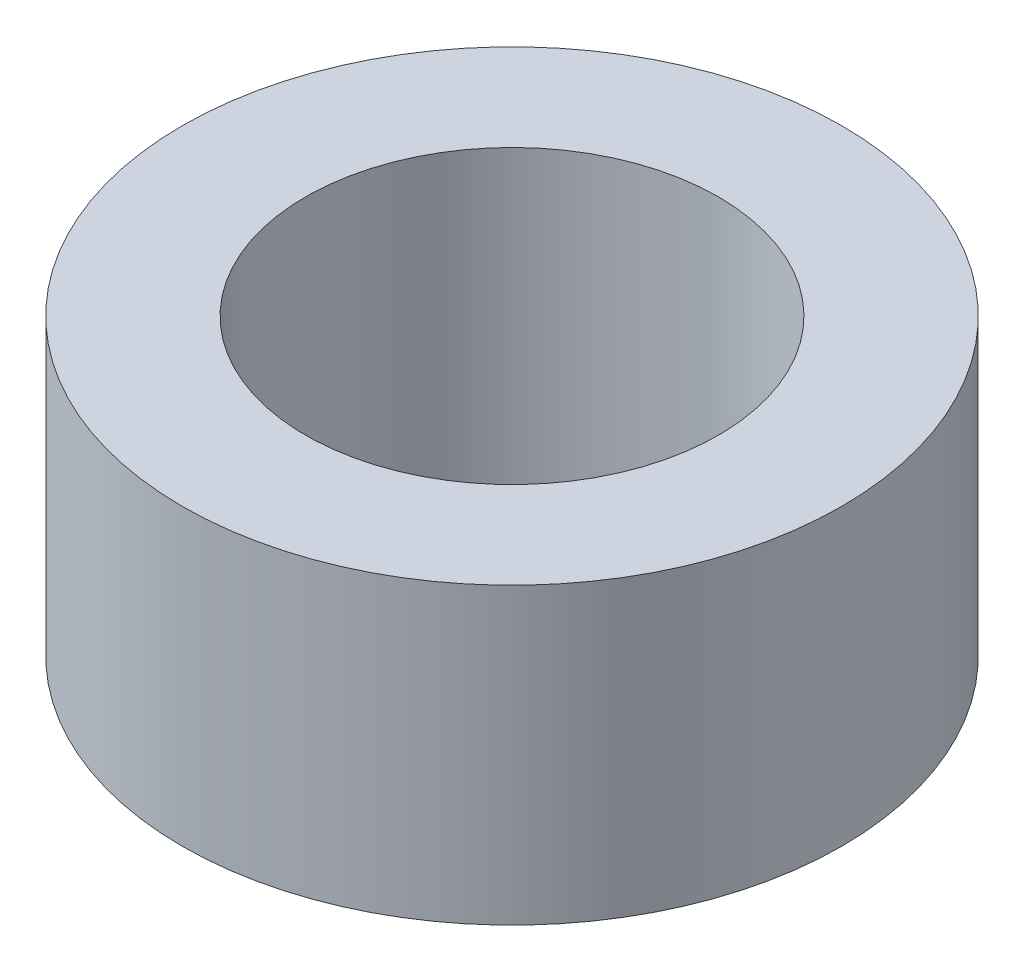
ISO-10303-21;
HEADER;
FILE_DESCRIPTION(('STEP AP214'),'2;1');
FILE_NAME('part.step','',(''),(''),'','','');
FILE_SCHEMA(('AUTOMOTIVE_DESIGN { 1 0 10303 214 1 1 1 1 }'));
ENDSEC;
DATA;
#1=APPLICATION_CONTEXT('core data for automotive mechanical design processes');
#2=APPLICATION_PROTOCOL_DEFINITION('international standard','automotive_design',2000,#1);
#3=PRODUCT_CONTEXT('',#1,'mechanical');
#4=PRODUCT('Part','Part','',(#3));
#5=PRODUCT_RELATED_PRODUCT_CATEGORY('part','',(#4));
#6=PRODUCT_DEFINITION_FORMATION('','',#4);
#7=PRODUCT_DEFINITION_CONTEXT('part definition',#1,'design');
#8=PRODUCT_DEFINITION('design','',#6,#7);
#9=PRODUCT_DEFINITION_SHAPE('','',#8);
#10=(LENGTH_UNIT() NAMED_UNIT(*) SI_UNIT(.MILLI.,.METRE.));
#11=(NAMED_UNIT(*) PLANE_ANGLE_UNIT() SI_UNIT($,.RADIAN.));
#12=(NAMED_UNIT(*) SI_UNIT($,.STERADIAN.) SOLID_ANGLE_UNIT());
#13=UNCERTAINTY_MEASURE_WITH_UNIT(LENGTH_MEASURE(1.E-05),#10,'distance_accuracy_value','');
#14=(GEOMETRIC_REPRESENTATION_CONTEXT(3) GLOBAL_UNCERTAINTY_ASSIGNED_CONTEXT((#13)) GLOBAL_UNIT_ASSIGNED_CONTEXT((#10,
#11,#12)) REPRESENTATION_CONTEXT('',''));
#15=CARTESIAN_POINT('',(0.,0.,0.));
#16=DIRECTION('',(0.,0.,1.));
#17=DIRECTION('',(1.,0.,0.));
#18=AXIS2_PLACEMENT_3D('',#15,#16,#17);
#19=CARTESIAN_POINT('',(0.,-9.525,0.));
#20=DIRECTION('',(0.,-1.,0.));
#21=DIRECTION('',(0.,0.,-1.));
#22=AXIS2_PLACEMENT_3D('',#19,#20,#21);
#23=CYLINDRICAL_SURFACE('',#22,6.6802);
#24=CARTESIAN_POINT('',(0.,0.,0.));
#25=DIRECTION('',(0.,-1.,0.));
#26=DIRECTION('',(0.,0.,-1.));
#27=AXIS2_PLACEMENT_3D('',#24,#25,#26);
#28=CIRCLE('',#27,6.6802);
#29=CARTESIAN_POINT('',(0.,0.,-6.6802));
#30=VERTEX_POINT('',#29);
#31=EDGE_CURVE('E27',#30,#30,#28,.T.);
#32=ORIENTED_EDGE('',*,*,#31,.F.);
#33=EDGE_LOOP('',(#32));
#34=FACE_BOUND('',#33,.T.);
#35=CARTESIAN_POINT('',(0.,-9.525,0.));
#36=DIRECTION('',(0.,-1.,0.));
#37=DIRECTION('',(0.,0.,-1.));
#38=AXIS2_PLACEMENT_3D('',#35,#36,#37);
#39=CIRCLE('',#38,6.6802);
#40=CARTESIAN_POINT('',(0.,-9.525,-6.6802));
#41=VERTEX_POINT('',#40);
#42=EDGE_CURVE('E18',#41,#41,#39,.T.);
#43=ORIENTED_EDGE('',*,*,#42,.T.);
#44=EDGE_LOOP('',(#43));
#45=FACE_BOUND('',#44,.T.);
#46=ADVANCED_FACE('F15',(#34,#45),#23,.F.);
#47=CARTESIAN_POINT('',(0.,-9.525,0.));
#48=DIRECTION('',(0.,1.,0.));
#49=DIRECTION('',(0.,0.,1.));
#50=AXIS2_PLACEMENT_3D('',#47,#48,#49);
#51=PLANE('',#50);
#52=CARTESIAN_POINT('',(0.,-9.525,0.));
#53=DIRECTION('',(0.,-1.,0.));
#54=DIRECTION('',(0.,0.,-1.));
#55=AXIS2_PLACEMENT_3D('',#52,#53,#54);
#56=CIRCLE('',#55,10.668);
#57=CARTESIAN_POINT('',(0.,-9.525,-10.668));
#58=VERTEX_POINT('',#57);
#59=EDGE_CURVE('E22',#58,#58,#56,.F.);
#60=ORIENTED_EDGE('',*,*,#59,.F.);
#61=EDGE_LOOP('',(#60));
#62=FACE_BOUND('',#61,.T.);
#63=ORIENTED_EDGE('',*,*,#42,.F.);
#64=EDGE_LOOP('',(#63));
#65=FACE_BOUND('',#64,.T.);
#66=ADVANCED_FACE('F36',(#62,#65),#51,.F.);
#67=CARTESIAN_POINT('',(0.,0.,0.));
#68=DIRECTION('',(0.,1.,0.));
#69=DIRECTION('',(0.,0.,1.));
#70=AXIS2_PLACEMENT_3D('',#67,#68,#69);
#71=PLANE('',#70);
#72=CARTESIAN_POINT('',(0.,0.,0.));
#73=DIRECTION('',(0.,-1.,0.));
#74=DIRECTION('',(0.,0.,-1.));
#75=AXIS2_PLACEMENT_3D('',#72,#73,#74);
#76=CIRCLE('',#75,10.668);
#77=CARTESIAN_POINT('',(0.,0.,-10.668));
#78=VERTEX_POINT('',#77);
#79=EDGE_CURVE('E10',#78,#78,#76,.T.);
#80=ORIENTED_EDGE('',*,*,#79,.F.);
#81=EDGE_LOOP('',(#80));
#82=FACE_BOUND('',#81,.T.);
#83=ORIENTED_EDGE('',*,*,#31,.T.);
#84=EDGE_LOOP('',(#83));
#85=FACE_BOUND('',#84,.T.);
#86=ADVANCED_FACE('F38',(#82,#85),#71,.T.);
#87=CARTESIAN_POINT('',(0.,-9.525,0.));
#88=DIRECTION('',(0.,-1.,0.));
#89=DIRECTION('',(0.,0.,-1.));
#90=AXIS2_PLACEMENT_3D('',#87,#88,#89);
#91=CYLINDRICAL_SURFACE('',#90,10.668);
#92=ORIENTED_EDGE('',*,*,#79,.T.);
#93=EDGE_LOOP('',(#92));
#94=FACE_BOUND('',#93,.T.);
#95=ORIENTED_EDGE('',*,*,#59,.T.);
#96=EDGE_LOOP('',(#95));
#97=FACE_BOUND('',#96,.T.);
#98=ADVANCED_FACE('F45',(#94,#97),#91,.T.);
#99=CLOSED_SHELL('',(#46,#66,#86,#98));
#100=MANIFOLD_SOLID_BREP('B1',#99);
#101=ADVANCED_BREP_SHAPE_REPRESENTATION('',(#18,#100),#14);
#102=SHAPE_DEFINITION_REPRESENTATION(#9,#101);
ENDSEC;
END-ISO-10303-21;
